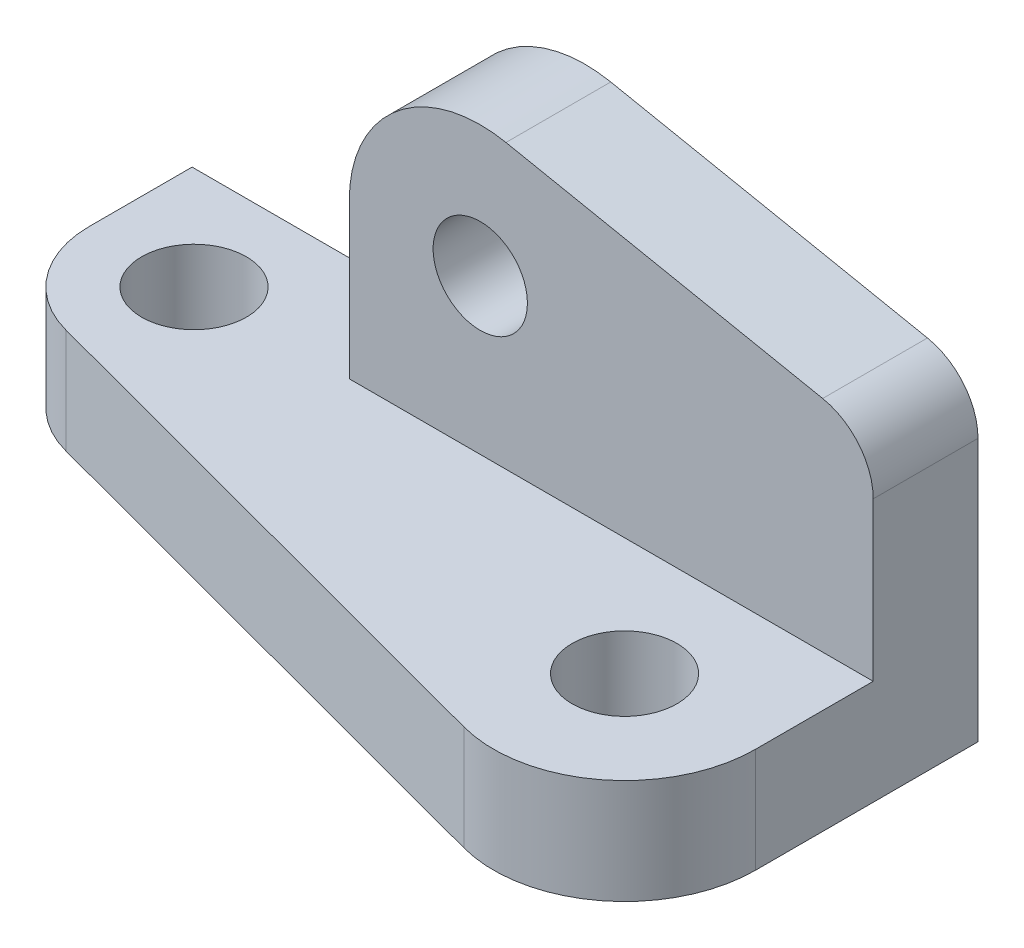
ISO-10303-21;
HEADER;
FILE_DESCRIPTION(('STEP AP214'),'2;1');
FILE_NAME('part.step','',(''),(''),'','','');
FILE_SCHEMA(('AUTOMOTIVE_DESIGN { 1 0 10303 214 1 1 1 1 }'));
ENDSEC;
DATA;
#1=APPLICATION_CONTEXT('core data for automotive mechanical design processes');
#2=APPLICATION_PROTOCOL_DEFINITION('international standard','automotive_design',2000,#1);
#3=PRODUCT_CONTEXT('',#1,'mechanical');
#4=PRODUCT('Part','Part','',(#3));
#5=PRODUCT_RELATED_PRODUCT_CATEGORY('part','',(#4));
#6=PRODUCT_DEFINITION_FORMATION('','',#4);
#7=PRODUCT_DEFINITION_CONTEXT('part definition',#1,'design');
#8=PRODUCT_DEFINITION('design','',#6,#7);
#9=PRODUCT_DEFINITION_SHAPE('','',#8);
#10=(LENGTH_UNIT() NAMED_UNIT(*) SI_UNIT(.MILLI.,.METRE.));
#11=(NAMED_UNIT(*) PLANE_ANGLE_UNIT() SI_UNIT($,.RADIAN.));
#12=(NAMED_UNIT(*) SI_UNIT($,.STERADIAN.) SOLID_ANGLE_UNIT());
#13=UNCERTAINTY_MEASURE_WITH_UNIT(LENGTH_MEASURE(1.E-05),#10,'distance_accuracy_value','');
#14=(GEOMETRIC_REPRESENTATION_CONTEXT(3) GLOBAL_UNCERTAINTY_ASSIGNED_CONTEXT((#13)) GLOBAL_UNIT_ASSIGNED_CONTEXT((#10,
#11,#12)) REPRESENTATION_CONTEXT('',''));
#15=CARTESIAN_POINT('',(0.,0.,0.));
#16=DIRECTION('',(0.,0.,1.));
#17=DIRECTION('',(1.,0.,0.));
#18=AXIS2_PLACEMENT_3D('',#15,#16,#17);
#19=CARTESIAN_POINT('',(0.,20.,35.));
#20=DIRECTION('',(1.,0.,0.));
#21=DIRECTION('',(0.,0.,-1.));
#22=AXIS2_PLACEMENT_3D('',#19,#20,#21);
#23=PLANE('',#22);
#24=DIRECTION('',(0.,0.,1.));
#25=VECTOR('',#24,1.);
#26=CARTESIAN_POINT('',(0.,0.,35.));
#27=LINE('',#26,#25);
#28=CARTESIAN_POINT('',(0.,0.,0.));
#29=VERTEX_POINT('',#28);
#30=CARTESIAN_POINT('',(0.,0.,19.63443373832));
#31=VERTEX_POINT('',#30);
#32=EDGE_CURVE('E138',#29,#31,#27,.T.);
#33=ORIENTED_EDGE('',*,*,#32,.T.);
#34=DIRECTION('',(0.,-1.,0.));
#35=VECTOR('',#34,1.);
#36=CARTESIAN_POINT('',(0.,20.,19.63443373832));
#37=LINE('',#36,#35);
#38=CARTESIAN_POINT('',(0.,20.,19.63443373832));
#39=VERTEX_POINT('',#38);
#40=EDGE_CURVE('E180',#31,#39,#37,.F.);
#41=ORIENTED_EDGE('',*,*,#40,.T.);
#42=DIRECTION('',(0.,0.,1.));
#43=VECTOR('',#42,1.);
#44=CARTESIAN_POINT('',(0.,20.,35.));
#45=LINE('',#44,#43);
#46=CARTESIAN_POINT('',(0.,20.,0.));
#47=VERTEX_POINT('',#46);
#48=EDGE_CURVE('E157',#47,#39,#45,.T.);
#49=ORIENTED_EDGE('',*,*,#48,.F.);
#50=DIRECTION('',(0.,-1.,0.));
#51=VECTOR('',#50,1.);
#52=CARTESIAN_POINT('',(0.,20.,0.));
#53=LINE('',#52,#51);
#54=EDGE_CURVE('E122',#47,#29,#53,.T.);
#55=ORIENTED_EDGE('',*,*,#54,.T.);
#56=EDGE_LOOP('',(#33,#41,#49,#55));
#57=FACE_BOUND('',#56,.T.);
#58=ADVANCED_FACE('F36',(#57),#23,.F.);
#59=CARTESIAN_POINT('',(150.,20.,75.));
#60=DIRECTION('',(0.257662650560332,0.,-0.966234939601246));
#61=DIRECTION('',(-0.966234939601246,0.,-0.257662650560332));
#62=AXIS2_PLACEMENT_3D('',#59,#60,#61);
#63=PLANE('',#62);
#64=DIRECTION('',(0.966234939601246,0.,0.257662650560332));
#65=VECTOR('',#64,1.);
#66=CARTESIAN_POINT('',(150.,0.,75.));
#67=LINE('',#66,#65);
#68=CARTESIAN_POINT('',(14.8467469887934,0.,38.9591325303449));
#69=VERTEX_POINT('',#68);
#70=CARTESIAN_POINT('',(118.558433735992,0.,66.6155823295978));
#71=VERTEX_POINT('',#70);
#72=EDGE_CURVE('E165',#69,#71,#67,.T.);
#73=ORIENTED_EDGE('',*,*,#72,.T.);
#74=DIRECTION('',(0.,-1.,0.));
#75=VECTOR('',#74,1.);
#76=CARTESIAN_POINT('',(118.558433735992,20.,66.6155823295978));
#77=LINE('',#76,#75);
#78=CARTESIAN_POINT('',(118.558433735992,20.,66.6155823295978));
#79=VERTEX_POINT('',#78);
#80=EDGE_CURVE('E196',#71,#79,#77,.F.);
#81=ORIENTED_EDGE('',*,*,#80,.T.);
#82=DIRECTION('',(0.966234939601246,0.,0.257662650560332));
#83=VECTOR('',#82,1.);
#84=CARTESIAN_POINT('',(150.,20.,75.));
#85=LINE('',#84,#83);
#86=CARTESIAN_POINT('',(14.8467469887934,20.,38.9591325303449));
#87=VERTEX_POINT('',#86);
#88=EDGE_CURVE('E159',#87,#79,#85,.T.);
#89=ORIENTED_EDGE('',*,*,#88,.F.);
#90=DIRECTION('',(0.,-1.,0.));
#91=VECTOR('',#90,1.);
#92=CARTESIAN_POINT('',(14.8467469887933,20.,38.9591325303449));
#93=LINE('',#92,#91);
#94=EDGE_CURVE('E175',#87,#69,#93,.T.);
#95=ORIENTED_EDGE('',*,*,#94,.T.);
#96=EDGE_LOOP('',(#73,#81,#89,#95));
#97=FACE_BOUND('',#96,.T.);
#98=ADVANCED_FACE('F258',(#97),#63,.F.);
#99=CARTESIAN_POINT('',(150.,20.,0.));
#100=DIRECTION('',(-1.,0.,0.));
#101=DIRECTION('',(0.,0.,1.));
#102=AXIS2_PLACEMENT_3D('',#99,#100,#101);
#103=PLANE('',#102);
#104=DIRECTION('',(0.,-1.,0.));
#105=VECTOR('',#104,1.);
#106=CARTESIAN_POINT('',(150.,20.,0.));
#107=LINE('',#106,#105);
#108=CARTESIAN_POINT('',(150.,50.1623531673773,0.));
#109=VERTEX_POINT('',#108);
#110=CARTESIAN_POINT('',(150.,0.,0.));
#111=VERTEX_POINT('',#110);
#112=EDGE_CURVE('E173',#109,#111,#107,.T.);
#113=ORIENTED_EDGE('',*,*,#112,.F.);
#114=DIRECTION('',(0.,0.,-1.));
#115=VECTOR('',#114,1.);
#116=CARTESIAN_POINT('',(150.,50.1623531673773,20.));
#117=LINE('',#116,#115);
#118=CARTESIAN_POINT('',(150.,50.1623531673773,20.));
#119=VERTEX_POINT('',#118);
#120=EDGE_CURVE('E44',#109,#119,#117,.F.);
#121=ORIENTED_EDGE('',*,*,#120,.T.);
#122=DIRECTION('',(0.,-1.,0.));
#123=VECTOR('',#122,1.);
#124=CARTESIAN_POINT('',(150.,0.,20.));
#125=LINE('',#124,#123);
#126=CARTESIAN_POINT('',(150.,20.,20.));
#127=VERTEX_POINT('',#126);
#128=EDGE_CURVE('E153',#119,#127,#125,.T.);
#129=ORIENTED_EDGE('',*,*,#128,.T.);
#130=DIRECTION('',(0.,0.,-1.));
#131=VECTOR('',#130,1.);
#132=CARTESIAN_POINT('',(150.,20.,0.));
#133=LINE('',#132,#131);
#134=CARTESIAN_POINT('',(150.,20.,42.4597088395666));
#135=VERTEX_POINT('',#134);
#136=EDGE_CURVE('E126',#135,#127,#133,.T.);
#137=ORIENTED_EDGE('',*,*,#136,.F.);
#138=DIRECTION('',(0.,-1.,0.));
#139=VECTOR('',#138,1.);
#140=CARTESIAN_POINT('',(150.,20.,42.4597088395666));
#141=LINE('',#140,#139);
#142=CARTESIAN_POINT('',(150.,0.,42.4597088395666));
#143=VERTEX_POINT('',#142);
#144=EDGE_CURVE('E191',#135,#143,#141,.T.);
#145=ORIENTED_EDGE('',*,*,#144,.T.);
#146=DIRECTION('',(0.,0.,-1.));
#147=VECTOR('',#146,1.);
#148=CARTESIAN_POINT('',(150.,0.,0.));
#149=LINE('',#148,#147);
#150=EDGE_CURVE('E168',#143,#111,#149,.T.);
#151=ORIENTED_EDGE('',*,*,#150,.T.);
#152=EDGE_LOOP('',(#113,#121,#129,#137,#145,#151));
#153=FACE_BOUND('',#152,.T.);
#154=ADVANCED_FACE('F264',(#153),#103,.F.);
#155=CARTESIAN_POINT('',(0.,20.,0.));
#156=DIRECTION('',(0.,0.,1.));
#157=DIRECTION('',(1.,0.,0.));
#158=AXIS2_PLACEMENT_3D('',#155,#156,#157);
#159=PLANE('',#158);
#160=CARTESIAN_POINT('',(75.,49.5049024320361,0.));
#161=DIRECTION('',(0.,0.,1.));
#162=DIRECTION('',(1.,0.,0.));
#163=AXIS2_PLACEMENT_3D('',#160,#161,#162);
#164=CIRCLE('',#163,8.99999999999999);
#165=CARTESIAN_POINT('',(84.,49.5049024320361,0.));
#166=VERTEX_POINT('',#165);
#167=EDGE_CURVE('E145',#166,#166,#164,.T.);
#168=ORIENTED_EDGE('',*,*,#167,.T.);
#169=EDGE_LOOP('',(#168));
#170=FACE_BOUND('',#169,.T.);
#171=DIRECTION('',(0.98058067569092,-0.196116135138184,0.));
#172=VECTOR('',#171,1.);
#173=CARTESIAN_POINT('',(150.,60.,0.));
#174=LINE('',#173,#172);
#175=CARTESIAN_POINT('',(79.9029033784546,74.0194193243091,0.));
#176=VERTEX_POINT('',#175);
#177=CARTESIAN_POINT('',(140.353393621658,61.9293212756684,0.));
#178=VERTEX_POINT('',#177);
#179=EDGE_CURVE('E144',#176,#178,#174,.T.);
#180=ORIENTED_EDGE('',*,*,#179,.T.);
#181=CARTESIAN_POINT('',(138.,50.1623531673773,0.));
#182=DIRECTION('',(0.,0.,1.));
#183=DIRECTION('',(1.,0.,0.));
#184=AXIS2_PLACEMENT_3D('',#181,#182,#183);
#185=CIRCLE('',#184,12.);
#186=EDGE_CURVE('E58',#178,#109,#185,.F.);
#187=ORIENTED_EDGE('',*,*,#186,.T.);
#188=ORIENTED_EDGE('',*,*,#112,.T.);
#189=DIRECTION('',(-1.,0.,0.));
#190=VECTOR('',#189,1.);
#191=CARTESIAN_POINT('',(0.,0.,0.));
#192=LINE('',#191,#190);
#193=EDGE_CURVE('E160',#111,#29,#192,.T.);
#194=ORIENTED_EDGE('',*,*,#193,.T.);
#195=ORIENTED_EDGE('',*,*,#54,.F.);
#196=DIRECTION('',(-1.,0.,0.));
#197=VECTOR('',#196,1.);
#198=CARTESIAN_POINT('',(0.,20.,0.));
#199=LINE('',#198,#197);
#200=CARTESIAN_POINT('',(50.,20.,0.));
#201=VERTEX_POINT('',#200);
#202=EDGE_CURVE('E116',#201,#47,#199,.T.);
#203=ORIENTED_EDGE('',*,*,#202,.F.);
#204=DIRECTION('',(0.,1.,0.));
#205=VECTOR('',#204,1.);
#206=CARTESIAN_POINT('',(50.,80.,0.));
#207=LINE('',#206,#205);
#208=CARTESIAN_POINT('',(50.,49.5049024320361,0.));
#209=VERTEX_POINT('',#208);
#210=EDGE_CURVE('E120',#201,#209,#207,.T.);
#211=ORIENTED_EDGE('',*,*,#210,.T.);
#212=CARTESIAN_POINT('',(75.,49.5049024320361,0.));
#213=DIRECTION('',(0.,0.,1.));
#214=DIRECTION('',(1.,0.,0.));
#215=AXIS2_PLACEMENT_3D('',#212,#213,#214);
#216=CIRCLE('',#215,25.);
#217=EDGE_CURVE('E185',#209,#176,#216,.F.);
#218=ORIENTED_EDGE('',*,*,#217,.T.);
#219=EDGE_LOOP('',(#180,#187,#188,#194,#195,#203,#211,#218));
#220=FACE_BOUND('',#219,.T.);
#221=ADVANCED_FACE('F118',(#170,#220),#159,.F.);
#222=CARTESIAN_POINT('',(0.,20.,0.));
#223=DIRECTION('',(0.,-1.,0.));
#224=DIRECTION('',(0.,0.,-1.));
#225=AXIS2_PLACEMENT_3D('',#222,#223,#224);
#226=PLANE('',#225);
#227=CARTESIAN_POINT('',(20.,20.,19.63443373832));
#228=DIRECTION('',(0.,1.,0.));
#229=DIRECTION('',(0.,0.,1.));
#230=AXIS2_PLACEMENT_3D('',#227,#228,#229);
#231=CIRCLE('',#230,10.);
#232=CARTESIAN_POINT('',(20.,20.,29.63443373832));
#233=VERTEX_POINT('',#232);
#234=EDGE_CURVE('E231',#233,#233,#231,.T.);
#235=ORIENTED_EDGE('',*,*,#234,.F.);
#236=EDGE_LOOP('',(#235));
#237=FACE_BOUND('',#236,.T.);
#238=CARTESIAN_POINT('',(125.,20.,42.4597088395666));
#239=DIRECTION('',(0.,1.,0.));
#240=DIRECTION('',(0.,0.,1.));
#241=AXIS2_PLACEMENT_3D('',#238,#239,#240);
#242=CIRCLE('',#241,10.);
#243=CARTESIAN_POINT('',(125.,20.,52.4597088395666));
#244=VERTEX_POINT('',#243);
#245=EDGE_CURVE('E225',#244,#244,#242,.T.);
#246=ORIENTED_EDGE('',*,*,#245,.F.);
#247=EDGE_LOOP('',(#246));
#248=FACE_BOUND('',#247,.T.);
#249=ORIENTED_EDGE('',*,*,#88,.T.);
#250=CARTESIAN_POINT('',(125.,20.,42.4597088395666));
#251=DIRECTION('',(0.,-1.,0.));
#252=DIRECTION('',(0.,0.,-1.));
#253=AXIS2_PLACEMENT_3D('',#250,#251,#252);
#254=CIRCLE('',#253,25.);
#255=EDGE_CURVE('E198',#79,#135,#254,.F.);
#256=ORIENTED_EDGE('',*,*,#255,.T.);
#257=ORIENTED_EDGE('',*,*,#136,.T.);
#258=DIRECTION('',(-1.,0.,0.));
#259=VECTOR('',#258,1.);
#260=CARTESIAN_POINT('',(0.,20.,20.));
#261=LINE('',#260,#259);
#262=CARTESIAN_POINT('',(50.,20.,20.));
#263=VERTEX_POINT('',#262);
#264=EDGE_CURVE('E134',#127,#263,#261,.T.);
#265=ORIENTED_EDGE('',*,*,#264,.T.);
#266=DIRECTION('',(0.,0.,-1.));
#267=VECTOR('',#266,1.);
#268=CARTESIAN_POINT('',(50.,20.,0.));
#269=LINE('',#268,#267);
#270=EDGE_CURVE('E129',#263,#201,#269,.T.);
#271=ORIENTED_EDGE('',*,*,#270,.T.);
#272=ORIENTED_EDGE('',*,*,#202,.T.);
#273=ORIENTED_EDGE('',*,*,#48,.T.);
#274=CARTESIAN_POINT('',(20.,20.,19.63443373832));
#275=DIRECTION('',(0.,-1.,0.));
#276=DIRECTION('',(0.,0.,-1.));
#277=AXIS2_PLACEMENT_3D('',#274,#275,#276);
#278=CIRCLE('',#277,20.);
#279=EDGE_CURVE('E182',#39,#87,#278,.F.);
#280=ORIENTED_EDGE('',*,*,#279,.T.);
#281=EDGE_LOOP('',(#249,#256,#257,#265,#271,#272,#273,#280));
#282=FACE_BOUND('',#281,.T.);
#283=ADVANCED_FACE('F131',(#237,#248,#282),#226,.F.);
#284=CARTESIAN_POINT('',(0.,0.,0.));
#285=DIRECTION('',(0.,-1.,0.));
#286=DIRECTION('',(0.,0.,-1.));
#287=AXIS2_PLACEMENT_3D('',#284,#285,#286);
#288=PLANE('',#287);
#289=CARTESIAN_POINT('',(20.,0.,19.63443373832));
#290=DIRECTION('',(0.,1.,0.));
#291=DIRECTION('',(0.,0.,1.));
#292=AXIS2_PLACEMENT_3D('',#289,#290,#291);
#293=CIRCLE('',#292,9.99999999999999);
#294=CARTESIAN_POINT('',(20.,0.,29.63443373832));
#295=VERTEX_POINT('',#294);
#296=EDGE_CURVE('E228',#295,#295,#293,.T.);
#297=ORIENTED_EDGE('',*,*,#296,.T.);
#298=EDGE_LOOP('',(#297));
#299=FACE_BOUND('',#298,.T.);
#300=CARTESIAN_POINT('',(125.,0.,42.4597088395666));
#301=DIRECTION('',(0.,1.,0.));
#302=DIRECTION('',(0.,0.,1.));
#303=AXIS2_PLACEMENT_3D('',#300,#301,#302);
#304=CIRCLE('',#303,10.);
#305=CARTESIAN_POINT('',(125.,0.,52.4597088395666));
#306=VERTEX_POINT('',#305);
#307=EDGE_CURVE('E222',#306,#306,#304,.T.);
#308=ORIENTED_EDGE('',*,*,#307,.T.);
#309=EDGE_LOOP('',(#308));
#310=FACE_BOUND('',#309,.T.);
#311=ORIENTED_EDGE('',*,*,#150,.F.);
#312=CARTESIAN_POINT('',(125.,0.,42.4597088395666));
#313=DIRECTION('',(0.,-1.,0.));
#314=DIRECTION('',(0.,0.,-1.));
#315=AXIS2_PLACEMENT_3D('',#312,#313,#314);
#316=CIRCLE('',#315,25.);
#317=EDGE_CURVE('E194',#143,#71,#316,.T.);
#318=ORIENTED_EDGE('',*,*,#317,.T.);
#319=ORIENTED_EDGE('',*,*,#72,.F.);
#320=CARTESIAN_POINT('',(20.,0.,19.63443373832));
#321=DIRECTION('',(0.,-1.,0.));
#322=DIRECTION('',(0.,0.,-1.));
#323=AXIS2_PLACEMENT_3D('',#320,#321,#322);
#324=CIRCLE('',#323,20.);
#325=EDGE_CURVE('E178',#69,#31,#324,.T.);
#326=ORIENTED_EDGE('',*,*,#325,.T.);
#327=ORIENTED_EDGE('',*,*,#32,.F.);
#328=ORIENTED_EDGE('',*,*,#193,.F.);
#329=EDGE_LOOP('',(#311,#318,#319,#326,#327,#328));
#330=FACE_BOUND('',#329,.T.);
#331=ADVANCED_FACE('F239',(#299,#310,#330),#288,.T.);
#332=CARTESIAN_POINT('',(50.,80.,20.));
#333=DIRECTION('',(-1.,0.,0.));
#334=DIRECTION('',(0.,-1.,0.));
#335=AXIS2_PLACEMENT_3D('',#332,#333,#334);
#336=PLANE('',#335);
#337=DIRECTION('',(0.,1.,0.));
#338=VECTOR('',#337,1.);
#339=CARTESIAN_POINT('',(50.,80.,20.));
#340=LINE('',#339,#338);
#341=CARTESIAN_POINT('',(50.,49.5049024320361,20.));
#342=VERTEX_POINT('',#341);
#343=EDGE_CURVE('E147',#263,#342,#340,.T.);
#344=ORIENTED_EDGE('',*,*,#343,.T.);
#345=DIRECTION('',(0.,0.,-1.));
#346=VECTOR('',#345,1.);
#347=CARTESIAN_POINT('',(50.,49.5049024320361,20.));
#348=LINE('',#347,#346);
#349=EDGE_CURVE('E143',#342,#209,#348,.T.);
#350=ORIENTED_EDGE('',*,*,#349,.T.);
#351=ORIENTED_EDGE('',*,*,#210,.F.);
#352=ORIENTED_EDGE('',*,*,#270,.F.);
#353=EDGE_LOOP('',(#344,#350,#351,#352));
#354=FACE_BOUND('',#353,.T.);
#355=ADVANCED_FACE('F141',(#354),#336,.T.);
#356=CARTESIAN_POINT('',(0.,0.,20.));
#357=DIRECTION('',(0.,0.,1.));
#358=DIRECTION('',(1.,0.,0.));
#359=AXIS2_PLACEMENT_3D('',#356,#357,#358);
#360=PLANE('',#359);
#361=CARTESIAN_POINT('',(75.,49.5049024320361,20.));
#362=DIRECTION('',(0.,0.,1.));
#363=DIRECTION('',(1.,0.,0.));
#364=AXIS2_PLACEMENT_3D('',#361,#362,#363);
#365=CIRCLE('',#364,9.00000000000001);
#366=CARTESIAN_POINT('',(84.,49.5049024320361,20.));
#367=VERTEX_POINT('',#366);
#368=EDGE_CURVE('E150',#367,#367,#365,.T.);
#369=ORIENTED_EDGE('',*,*,#368,.F.);
#370=EDGE_LOOP('',(#369));
#371=FACE_BOUND('',#370,.T.);
#372=ORIENTED_EDGE('',*,*,#128,.F.);
#373=CARTESIAN_POINT('',(138.,50.1623531673773,20.));
#374=DIRECTION('',(0.,0.,1.));
#375=DIRECTION('',(1.,0.,0.));
#376=AXIS2_PLACEMENT_3D('',#373,#374,#375);
#377=CIRCLE('',#376,12.);
#378=CARTESIAN_POINT('',(140.353393621658,61.9293212756684,20.));
#379=VERTEX_POINT('',#378);
#380=EDGE_CURVE('E11',#119,#379,#377,.T.);
#381=ORIENTED_EDGE('',*,*,#380,.T.);
#382=DIRECTION('',(0.98058067569092,-0.196116135138184,0.));
#383=VECTOR('',#382,1.);
#384=CARTESIAN_POINT('',(150.,60.,20.));
#385=LINE('',#384,#383);
#386=CARTESIAN_POINT('',(79.9029033784546,74.0194193243091,20.));
#387=VERTEX_POINT('',#386);
#388=EDGE_CURVE('E210',#387,#379,#385,.T.);
#389=ORIENTED_EDGE('',*,*,#388,.F.);
#390=CARTESIAN_POINT('',(75.,49.5049024320361,20.));
#391=DIRECTION('',(0.,0.,1.));
#392=DIRECTION('',(1.,0.,0.));
#393=AXIS2_PLACEMENT_3D('',#390,#391,#392);
#394=CIRCLE('',#393,25.);
#395=EDGE_CURVE('E189',#387,#342,#394,.T.);
#396=ORIENTED_EDGE('',*,*,#395,.T.);
#397=ORIENTED_EDGE('',*,*,#343,.F.);
#398=ORIENTED_EDGE('',*,*,#264,.F.);
#399=EDGE_LOOP('',(#372,#381,#389,#396,#397,#398));
#400=FACE_BOUND('',#399,.T.);
#401=ADVANCED_FACE('F217',(#371,#400),#360,.T.);
#402=CARTESIAN_POINT('',(150.,60.,20.));
#403=DIRECTION('',(0.196116135138184,0.98058067569092,0.));
#404=DIRECTION('',(-0.98058067569092,0.196116135138184,0.));
#405=AXIS2_PLACEMENT_3D('',#402,#403,#404);
#406=PLANE('',#405);
#407=ORIENTED_EDGE('',*,*,#388,.T.);
#408=DIRECTION('',(0.,0.,-1.));
#409=VECTOR('',#408,1.);
#410=CARTESIAN_POINT('',(140.353393621658,61.9293212756684,0.));
#411=LINE('',#410,#409);
#412=EDGE_CURVE('E200',#379,#178,#411,.T.);
#413=ORIENTED_EDGE('',*,*,#412,.T.);
#414=ORIENTED_EDGE('',*,*,#179,.F.);
#415=DIRECTION('',(0.,0.,-1.));
#416=VECTOR('',#415,1.);
#417=CARTESIAN_POINT('',(79.9029033784546,74.0194193243091,20.));
#418=LINE('',#417,#416);
#419=EDGE_CURVE('E187',#176,#387,#418,.F.);
#420=ORIENTED_EDGE('',*,*,#419,.T.);
#421=EDGE_LOOP('',(#407,#413,#414,#420));
#422=FACE_BOUND('',#421,.T.);
#423=ADVANCED_FACE('F207',(#422),#406,.T.);
#424=CARTESIAN_POINT('',(20.,20.,19.63443373832));
#425=DIRECTION('',(0.,-1.,0.));
#426=DIRECTION('',(0.,0.,-1.));
#427=AXIS2_PLACEMENT_3D('',#424,#425,#426);
#428=CYLINDRICAL_SURFACE('',#427,20.);
#429=ORIENTED_EDGE('',*,*,#279,.F.);
#430=ORIENTED_EDGE('',*,*,#40,.F.);
#431=ORIENTED_EDGE('',*,*,#325,.F.);
#432=ORIENTED_EDGE('',*,*,#94,.F.);
#433=EDGE_LOOP('',(#429,#430,#431,#432));
#434=FACE_BOUND('',#433,.T.);
#435=ADVANCED_FACE('F269',(#434),#428,.T.);
#436=CARTESIAN_POINT('',(75.,49.5049024320361,20.));
#437=DIRECTION('',(0.,0.,-1.));
#438=DIRECTION('',(-1.,0.,0.));
#439=AXIS2_PLACEMENT_3D('',#436,#437,#438);
#440=CYLINDRICAL_SURFACE('',#439,25.);
#441=ORIENTED_EDGE('',*,*,#395,.F.);
#442=ORIENTED_EDGE('',*,*,#419,.F.);
#443=ORIENTED_EDGE('',*,*,#217,.F.);
#444=ORIENTED_EDGE('',*,*,#349,.F.);
#445=EDGE_LOOP('',(#441,#442,#443,#444));
#446=FACE_BOUND('',#445,.T.);
#447=ADVANCED_FACE('F215',(#446),#440,.T.);
#448=CARTESIAN_POINT('',(125.,20.,42.4597088395666));
#449=DIRECTION('',(0.,-1.,0.));
#450=DIRECTION('',(0.,0.,-1.));
#451=AXIS2_PLACEMENT_3D('',#448,#449,#450);
#452=CYLINDRICAL_SURFACE('',#451,25.);
#453=ORIENTED_EDGE('',*,*,#255,.F.);
#454=ORIENTED_EDGE('',*,*,#80,.F.);
#455=ORIENTED_EDGE('',*,*,#317,.F.);
#456=ORIENTED_EDGE('',*,*,#144,.F.);
#457=EDGE_LOOP('',(#453,#454,#455,#456));
#458=FACE_BOUND('',#457,.T.);
#459=ADVANCED_FACE('F274',(#458),#452,.T.);
#460=CARTESIAN_POINT('',(138.,50.1623531673773,20.));
#461=DIRECTION('',(0.,0.,1.));
#462=DIRECTION('',(1.,0.,0.));
#463=AXIS2_PLACEMENT_3D('',#460,#461,#462);
#464=CYLINDRICAL_SURFACE('',#463,12.);
#465=ORIENTED_EDGE('',*,*,#380,.F.);
#466=ORIENTED_EDGE('',*,*,#120,.F.);
#467=ORIENTED_EDGE('',*,*,#186,.F.);
#468=ORIENTED_EDGE('',*,*,#412,.F.);
#469=EDGE_LOOP('',(#465,#466,#467,#468));
#470=FACE_BOUND('',#469,.T.);
#471=ADVANCED_FACE('F38',(#470),#464,.T.);
#472=CARTESIAN_POINT('',(75.,49.5049024320361,20.));
#473=DIRECTION('',(0.,0.,1.));
#474=DIRECTION('',(1.,0.,0.));
#475=AXIS2_PLACEMENT_3D('',#472,#473,#474);
#476=CYLINDRICAL_SURFACE('',#475,9.);
#477=ORIENTED_EDGE('',*,*,#167,.F.);
#478=EDGE_LOOP('',(#477));
#479=FACE_BOUND('',#478,.T.);
#480=ORIENTED_EDGE('',*,*,#368,.T.);
#481=EDGE_LOOP('',(#480));
#482=FACE_BOUND('',#481,.T.);
#483=ADVANCED_FACE('F245',(#479,#482),#476,.F.);
#484=CARTESIAN_POINT('',(125.,20.,42.4597088395666));
#485=DIRECTION('',(0.,1.,0.));
#486=DIRECTION('',(0.,0.,1.));
#487=AXIS2_PLACEMENT_3D('',#484,#485,#486);
#488=CYLINDRICAL_SURFACE('',#487,10.);
#489=ORIENTED_EDGE('',*,*,#307,.F.);
#490=EDGE_LOOP('',(#489));
#491=FACE_BOUND('',#490,.T.);
#492=ORIENTED_EDGE('',*,*,#245,.T.);
#493=EDGE_LOOP('',(#492));
#494=FACE_BOUND('',#493,.T.);
#495=ADVANCED_FACE('F243',(#491,#494),#488,.F.);
#496=CARTESIAN_POINT('',(20.,20.,19.63443373832));
#497=DIRECTION('',(0.,1.,0.));
#498=DIRECTION('',(0.,0.,1.));
#499=AXIS2_PLACEMENT_3D('',#496,#497,#498);
#500=CYLINDRICAL_SURFACE('',#499,10.);
#501=ORIENTED_EDGE('',*,*,#296,.F.);
#502=EDGE_LOOP('',(#501));
#503=FACE_BOUND('',#502,.T.);
#504=ORIENTED_EDGE('',*,*,#234,.T.);
#505=EDGE_LOOP('',(#504));
#506=FACE_BOUND('',#505,.T.);
#507=ADVANCED_FACE('F235',(#503,#506),#500,.F.);
#508=CLOSED_SHELL('',(#58,#98,#154,#221,#283,#331,#355,#401,#423,#435,#447,#459,#471,#483,#495,#507));
#509=MANIFOLD_SOLID_BREP('B2',#508);
#510=ADVANCED_BREP_SHAPE_REPRESENTATION('',(#18,#509),#14);
#511=SHAPE_DEFINITION_REPRESENTATION(#9,#510);
ENDSEC;
END-ISO-10303-21;
